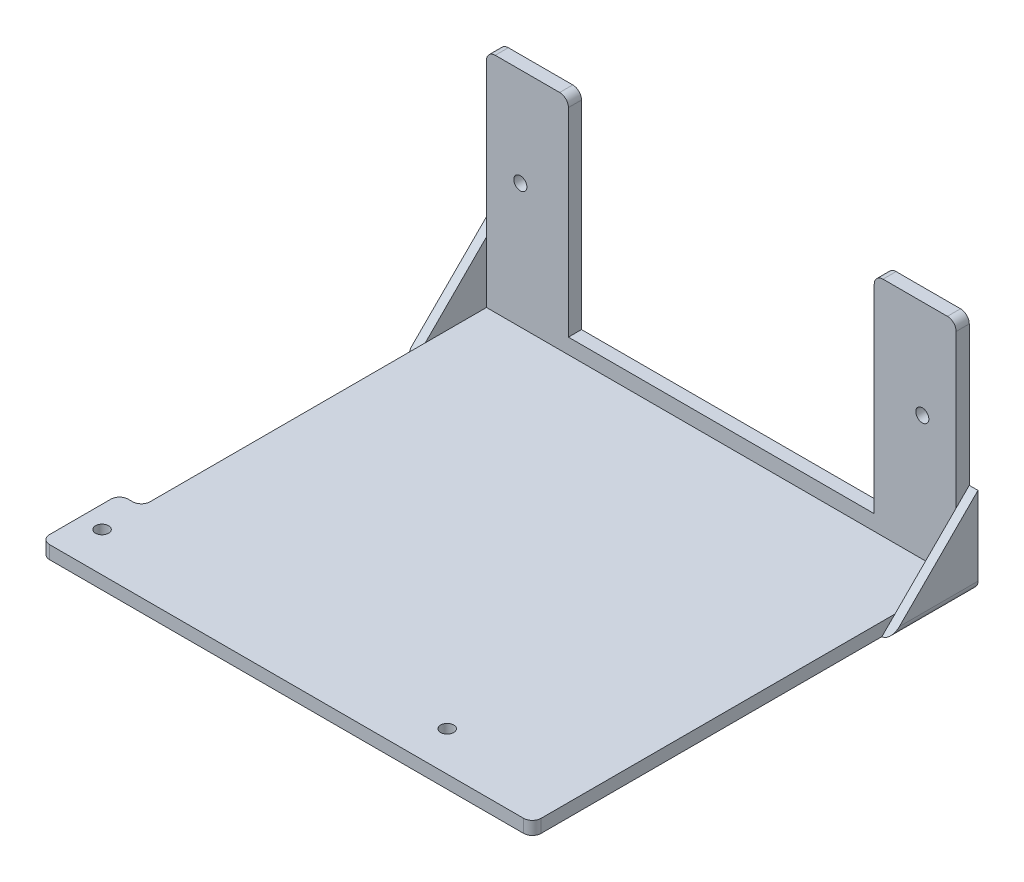
ISO-10303-21;
HEADER;
FILE_DESCRIPTION(('STEP AP214'),'2;1');
FILE_NAME('part.step','',(''),(''),'','','');
FILE_SCHEMA(('AUTOMOTIVE_DESIGN { 1 0 10303 214 1 1 1 1 }'));
ENDSEC;
DATA;
#1=APPLICATION_CONTEXT('core data for automotive mechanical design processes');
#2=APPLICATION_PROTOCOL_DEFINITION('international standard','automotive_design',2000,#1);
#3=PRODUCT_CONTEXT('',#1,'mechanical');
#4=PRODUCT('Part','Part','',(#3));
#5=PRODUCT_RELATED_PRODUCT_CATEGORY('part','',(#4));
#6=PRODUCT_DEFINITION_FORMATION('','',#4);
#7=PRODUCT_DEFINITION_CONTEXT('part definition',#1,'design');
#8=PRODUCT_DEFINITION('design','',#6,#7);
#9=PRODUCT_DEFINITION_SHAPE('','',#8);
#10=(LENGTH_UNIT() NAMED_UNIT(*) SI_UNIT(.MILLI.,.METRE.));
#11=(NAMED_UNIT(*) PLANE_ANGLE_UNIT() SI_UNIT($,.RADIAN.));
#12=(NAMED_UNIT(*) SI_UNIT($,.STERADIAN.) SOLID_ANGLE_UNIT());
#13=UNCERTAINTY_MEASURE_WITH_UNIT(LENGTH_MEASURE(1.E-05),#10,'distance_accuracy_value','');
#14=(GEOMETRIC_REPRESENTATION_CONTEXT(3) GLOBAL_UNCERTAINTY_ASSIGNED_CONTEXT((#13)) GLOBAL_UNIT_ASSIGNED_CONTEXT((#10,
#11,#12)) REPRESENTATION_CONTEXT('',''));
#15=CARTESIAN_POINT('',(0.,0.,0.));
#16=DIRECTION('',(0.,0.,1.));
#17=DIRECTION('',(1.,0.,0.));
#18=AXIS2_PLACEMENT_3D('',#15,#16,#17);
#19=CARTESIAN_POINT('',(53.75,54.,3.));
#20=DIRECTION('',(-1.,0.,0.));
#21=DIRECTION('',(0.,-1.,0.));
#22=AXIS2_PLACEMENT_3D('',#19,#20,#21);
#23=PLANE('',#22);
#24=DIRECTION('',(0.,1.,0.));
#25=VECTOR('',#24,1.);
#26=CARTESIAN_POINT('',(53.75,54.,0.));
#27=LINE('',#26,#25);
#28=CARTESIAN_POINT('',(53.75,20.,0.));
#29=VERTEX_POINT('',#28);
#30=CARTESIAN_POINT('',(53.75,52.,0.));
#31=VERTEX_POINT('',#30);
#32=EDGE_CURVE('E236',#29,#31,#27,.T.);
#33=ORIENTED_EDGE('',*,*,#32,.T.);
#34=DIRECTION('',(0.,0.,-1.));
#35=VECTOR('',#34,1.);
#36=CARTESIAN_POINT('',(53.75,52.,3.));
#37=LINE('',#36,#35);
#38=CARTESIAN_POINT('',(53.75,52.,3.));
#39=VERTEX_POINT('',#38);
#40=EDGE_CURVE('E390',#31,#39,#37,.F.);
#41=ORIENTED_EDGE('',*,*,#40,.T.);
#42=DIRECTION('',(0.,1.,0.));
#43=VECTOR('',#42,1.);
#44=CARTESIAN_POINT('',(53.75,54.,3.));
#45=LINE('',#44,#43);
#46=CARTESIAN_POINT('',(53.75,17.,3.));
#47=VERTEX_POINT('',#46);
#48=EDGE_CURVE('E338',#47,#39,#45,.T.);
#49=ORIENTED_EDGE('',*,*,#48,.F.);
#50=DIRECTION('',(0.,-0.707106781186551,0.707106781186544));
#51=VECTOR('',#50,1.);
#52=CARTESIAN_POINT('',(53.75,20.,0.));
#53=LINE('',#52,#51);
#54=EDGE_CURVE('E228',#29,#47,#53,.T.);
#55=ORIENTED_EDGE('',*,*,#54,.F.);
#56=EDGE_LOOP('',(#33,#41,#49,#55));
#57=FACE_BOUND('',#56,.T.);
#58=ADVANCED_FACE('F39',(#57),#23,.F.);
#59=DIRECTION('',(0.,0.,-1.));
#60=VECTOR('',#59,1.);
#61=CARTESIAN_POINT('',(53.75,3.,100.));
#62=LINE('',#61,#60);
#63=CARTESIAN_POINT('',(53.75,3.,98.));
#64=VERTEX_POINT('',#63);
#65=CARTESIAN_POINT('',(53.75,2.99999999999999,16.9999999999998));
#66=VERTEX_POINT('',#65);
#67=EDGE_CURVE('E333',#64,#66,#62,.T.);
#68=ORIENTED_EDGE('',*,*,#67,.F.);
#69=DIRECTION('',(0.,1.,0.));
#70=VECTOR('',#69,1.);
#71=CARTESIAN_POINT('',(53.75,0.,98.));
#72=LINE('',#71,#70);
#73=CARTESIAN_POINT('',(53.75,0.,98.));
#74=VERTEX_POINT('',#73);
#75=EDGE_CURVE('E423',#64,#74,#72,.F.);
#76=ORIENTED_EDGE('',*,*,#75,.T.);
#77=DIRECTION('',(0.,0.,-1.));
#78=VECTOR('',#77,1.);
#79=CARTESIAN_POINT('',(53.75,0.,3.));
#80=LINE('',#79,#78);
#81=CARTESIAN_POINT('',(53.75,0.,19.9999999999998));
#82=VERTEX_POINT('',#81);
#83=EDGE_CURVE('E355',#74,#82,#80,.T.);
#84=ORIENTED_EDGE('',*,*,#83,.T.);
#85=EDGE_CURVE('E248',#66,#82,#53,.T.);
#86=ORIENTED_EDGE('',*,*,#85,.F.);
#87=EDGE_LOOP('',(#68,#76,#84,#86));
#88=FACE_BOUND('',#87,.T.);
#89=ADVANCED_FACE('F475',(#88),#23,.F.);
#90=CARTESIAN_POINT('',(-53.75,54.,3.));
#91=DIRECTION('',(1.,0.,0.));
#92=DIRECTION('',(0.,1.,0.));
#93=AXIS2_PLACEMENT_3D('',#90,#91,#92);
#94=PLANE('',#93);
#95=DIRECTION('',(0.,0.,-1.));
#96=VECTOR('',#95,1.);
#97=CARTESIAN_POINT('',(-53.75,0.,3.));
#98=LINE('',#97,#96);
#99=CARTESIAN_POINT('',(-53.75,0.,80.));
#100=VERTEX_POINT('',#99);
#101=CARTESIAN_POINT('',(-53.75,0.,20.));
#102=VERTEX_POINT('',#101);
#103=EDGE_CURVE('E357',#100,#102,#98,.T.);
#104=ORIENTED_EDGE('',*,*,#103,.F.);
#105=DIRECTION('',(0.,1.,0.));
#106=VECTOR('',#105,1.);
#107=CARTESIAN_POINT('',(-53.75,54.,80.));
#108=LINE('',#107,#106);
#109=CARTESIAN_POINT('',(-53.75,2.99999999999999,80.));
#110=VERTEX_POINT('',#109);
#111=EDGE_CURVE('E439',#100,#110,#108,.T.);
#112=ORIENTED_EDGE('',*,*,#111,.T.);
#113=DIRECTION('',(0.,0.,-1.));
#114=VECTOR('',#113,1.);
#115=CARTESIAN_POINT('',(-53.75,2.99999999999999,100.));
#116=LINE('',#115,#114);
#117=CARTESIAN_POINT('',(-53.75,2.99999999999999,17.));
#118=VERTEX_POINT('',#117);
#119=EDGE_CURVE('E330',#110,#118,#116,.T.);
#120=ORIENTED_EDGE('',*,*,#119,.T.);
#121=DIRECTION('',(0.,0.707106781186548,-0.707106781186547));
#122=VECTOR('',#121,1.);
#123=CARTESIAN_POINT('',(-53.75,0.,20.));
#124=LINE('',#123,#122);
#125=EDGE_CURVE('E254',#102,#118,#124,.T.);
#126=ORIENTED_EDGE('',*,*,#125,.F.);
#127=EDGE_LOOP('',(#104,#112,#120,#126));
#128=FACE_BOUND('',#127,.T.);
#129=ADVANCED_FACE('F456',(#128),#94,.F.);
#130=DIRECTION('',(0.,-1.,0.));
#131=VECTOR('',#130,1.);
#132=CARTESIAN_POINT('',(-53.75,54.,3.));
#133=LINE('',#132,#131);
#134=CARTESIAN_POINT('',(-53.75,52.,3.));
#135=VERTEX_POINT('',#134);
#136=CARTESIAN_POINT('',(-53.75,17.,3.));
#137=VERTEX_POINT('',#136);
#138=EDGE_CURVE('E336',#135,#137,#133,.T.);
#139=ORIENTED_EDGE('',*,*,#138,.F.);
#140=DIRECTION('',(0.,0.,-1.));
#141=VECTOR('',#140,1.);
#142=CARTESIAN_POINT('',(-53.75,52.,3.));
#143=LINE('',#142,#141);
#144=CARTESIAN_POINT('',(-53.75,52.,0.));
#145=VERTEX_POINT('',#144);
#146=EDGE_CURVE('E409',#135,#145,#143,.T.);
#147=ORIENTED_EDGE('',*,*,#146,.T.);
#148=DIRECTION('',(0.,-1.,0.));
#149=VECTOR('',#148,1.);
#150=CARTESIAN_POINT('',(-53.75,54.,0.));
#151=LINE('',#150,#149);
#152=CARTESIAN_POINT('',(-53.75,20.,0.));
#153=VERTEX_POINT('',#152);
#154=EDGE_CURVE('E335',#145,#153,#151,.T.);
#155=ORIENTED_EDGE('',*,*,#154,.T.);
#156=EDGE_CURVE('E239',#137,#153,#124,.T.);
#157=ORIENTED_EDGE('',*,*,#156,.F.);
#158=EDGE_LOOP('',(#139,#147,#155,#157));
#159=FACE_BOUND('',#158,.T.);
#160=ADVANCED_FACE('F528',(#159),#94,.F.);
#161=CARTESIAN_POINT('',(-53.75,54.,3.));
#162=DIRECTION('',(0.,-1.,0.));
#163=DIRECTION('',(1.,0.,0.));
#164=AXIS2_PLACEMENT_3D('',#161,#162,#163);
#165=PLANE('',#164);
#166=DIRECTION('',(-1.,0.,0.));
#167=VECTOR('',#166,1.);
#168=CARTESIAN_POINT('',(-53.75,54.,3.));
#169=LINE('',#168,#167);
#170=CARTESIAN_POINT('',(-37.,54.,3.));
#171=VERTEX_POINT('',#170);
#172=CARTESIAN_POINT('',(-51.75,54.,3.));
#173=VERTEX_POINT('',#172);
#174=EDGE_CURVE('E343',#171,#173,#169,.T.);
#175=ORIENTED_EDGE('',*,*,#174,.F.);
#176=DIRECTION('',(0.,0.,1.));
#177=VECTOR('',#176,1.);
#178=CARTESIAN_POINT('',(-37.,54.,3.));
#179=LINE('',#178,#177);
#180=CARTESIAN_POINT('',(-37.,54.,0.));
#181=VERTEX_POINT('',#180);
#182=EDGE_CURVE('E407',#171,#181,#179,.F.);
#183=ORIENTED_EDGE('',*,*,#182,.T.);
#184=DIRECTION('',(-1.,0.,0.));
#185=VECTOR('',#184,1.);
#186=CARTESIAN_POINT('',(-53.75,54.,0.));
#187=LINE('',#186,#185);
#188=CARTESIAN_POINT('',(-51.75,54.,0.));
#189=VERTEX_POINT('',#188);
#190=EDGE_CURVE('E352',#181,#189,#187,.T.);
#191=ORIENTED_EDGE('',*,*,#190,.T.);
#192=DIRECTION('',(0.,0.,-1.));
#193=VECTOR('',#192,1.);
#194=CARTESIAN_POINT('',(-51.75,54.,3.));
#195=LINE('',#194,#193);
#196=EDGE_CURVE('E405',#189,#173,#195,.F.);
#197=ORIENTED_EDGE('',*,*,#196,.T.);
#198=EDGE_LOOP('',(#175,#183,#191,#197));
#199=FACE_BOUND('',#198,.T.);
#200=ADVANCED_FACE('F524',(#199),#165,.F.);
#201=CARTESIAN_POINT('',(-53.75,0.,3.));
#202=DIRECTION('',(0.,1.,0.));
#203=DIRECTION('',(0.,0.,1.));
#204=AXIS2_PLACEMENT_3D('',#201,#202,#203);
#205=PLANE('',#204);
#206=CARTESIAN_POINT('',(-53.75,0.,91.));
#207=DIRECTION('',(0.,1.,0.));
#208=DIRECTION('',(-1.,0.,0.));
#209=AXIS2_PLACEMENT_3D('',#206,#207,#208);
#210=CIRCLE('',#209,1.5);
#211=CARTESIAN_POINT('',(-55.25,0.,91.));
#212=VERTEX_POINT('',#211);
#213=EDGE_CURVE('E299',#212,#212,#210,.T.);
#214=ORIENTED_EDGE('',*,*,#213,.T.);
#215=EDGE_LOOP('',(#214));
#216=FACE_BOUND('',#215,.T.);
#217=CARTESIAN_POINT('',(25.25,0.,91.));
#218=DIRECTION('',(0.,1.,0.));
#219=DIRECTION('',(-1.,0.,0.));
#220=AXIS2_PLACEMENT_3D('',#217,#218,#219);
#221=CIRCLE('',#220,1.5);
#222=CARTESIAN_POINT('',(23.75,0.,91.));
#223=VERTEX_POINT('',#222);
#224=EDGE_CURVE('E306',#223,#223,#221,.T.);
#225=ORIENTED_EDGE('',*,*,#224,.T.);
#226=EDGE_LOOP('',(#225));
#227=FACE_BOUND('',#226,.T.);
#228=ORIENTED_EDGE('',*,*,#83,.F.);
#229=CARTESIAN_POINT('',(51.75,0.,98.));
#230=DIRECTION('',(0.,1.,0.));
#231=DIRECTION('',(0.,0.,1.));
#232=AXIS2_PLACEMENT_3D('',#229,#230,#231);
#233=CIRCLE('',#232,2.);
#234=CARTESIAN_POINT('',(51.75,0.,100.));
#235=VERTEX_POINT('',#234);
#236=EDGE_CURVE('E428',#74,#235,#233,.F.);
#237=ORIENTED_EDGE('',*,*,#236,.T.);
#238=DIRECTION('',(1.,0.,0.));
#239=VECTOR('',#238,1.);
#240=CARTESIAN_POINT('',(53.75,0.,100.));
#241=LINE('',#240,#239);
#242=CARTESIAN_POINT('',(-56.75,0.,100.));
#243=VERTEX_POINT('',#242);
#244=EDGE_CURVE('E325',#243,#235,#241,.T.);
#245=ORIENTED_EDGE('',*,*,#244,.F.);
#246=CARTESIAN_POINT('',(-56.75,0.,98.));
#247=DIRECTION('',(0.,1.,0.));
#248=DIRECTION('',(0.,0.,1.));
#249=AXIS2_PLACEMENT_3D('',#246,#247,#248);
#250=CIRCLE('',#249,2.);
#251=CARTESIAN_POINT('',(-58.75,0.,98.));
#252=VERTEX_POINT('',#251);
#253=EDGE_CURVE('E426',#243,#252,#250,.F.);
#254=ORIENTED_EDGE('',*,*,#253,.T.);
#255=DIRECTION('',(0.,0.,1.));
#256=VECTOR('',#255,1.);
#257=CARTESIAN_POINT('',(-58.75,0.,100.));
#258=LINE('',#257,#256);
#259=CARTESIAN_POINT('',(-58.75,0.,84.));
#260=VERTEX_POINT('',#259);
#261=EDGE_CURVE('E313',#260,#252,#258,.T.);
#262=ORIENTED_EDGE('',*,*,#261,.F.);
#263=CARTESIAN_POINT('',(-56.75,0.,84.));
#264=DIRECTION('',(0.,1.,0.));
#265=DIRECTION('',(0.,0.,1.));
#266=AXIS2_PLACEMENT_3D('',#263,#264,#265);
#267=CIRCLE('',#266,2.);
#268=CARTESIAN_POINT('',(-56.75,0.,82.));
#269=VERTEX_POINT('',#268);
#270=EDGE_CURVE('E54',#260,#269,#267,.F.);
#271=ORIENTED_EDGE('',*,*,#270,.T.);
#272=DIRECTION('',(-1.,0.,0.));
#273=VECTOR('',#272,1.);
#274=CARTESIAN_POINT('',(-53.75,0.,82.));
#275=LINE('',#274,#273);
#276=CARTESIAN_POINT('',(-55.75,0.,82.));
#277=VERTEX_POINT('',#276);
#278=EDGE_CURVE('E311',#277,#269,#275,.T.);
#279=ORIENTED_EDGE('',*,*,#278,.F.);
#280=CARTESIAN_POINT('',(-55.75,0.,80.));
#281=DIRECTION('',(0.,1.,0.));
#282=DIRECTION('',(0.,0.,1.));
#283=AXIS2_PLACEMENT_3D('',#280,#281,#282);
#284=CIRCLE('',#283,2.);
#285=EDGE_CURVE('E11',#277,#100,#284,.T.);
#286=ORIENTED_EDGE('',*,*,#285,.T.);
#287=ORIENTED_EDGE('',*,*,#103,.T.);
#288=DIRECTION('',(0.,0.,1.));
#289=VECTOR('',#288,1.);
#290=CARTESIAN_POINT('',(-53.75,0.,0.));
#291=LINE('',#290,#289);
#292=CARTESIAN_POINT('',(-53.75,0.,0.));
#293=VERTEX_POINT('',#292);
#294=EDGE_CURVE('E368',#102,#293,#291,.F.);
#295=ORIENTED_EDGE('',*,*,#294,.T.);
#296=DIRECTION('',(1.,0.,0.));
#297=VECTOR('',#296,1.);
#298=CARTESIAN_POINT('',(-53.75,0.,0.));
#299=LINE('',#298,#297);
#300=CARTESIAN_POINT('',(53.75,0.,0.));
#301=VERTEX_POINT('',#300);
#302=EDGE_CURVE('E348',#293,#301,#299,.T.);
#303=ORIENTED_EDGE('',*,*,#302,.T.);
#304=DIRECTION('',(0.,0.,-1.));
#305=VECTOR('',#304,1.);
#306=CARTESIAN_POINT('',(53.75,0.,19.9999999999998));
#307=LINE('',#306,#305);
#308=EDGE_CURVE('E365',#301,#82,#307,.F.);
#309=ORIENTED_EDGE('',*,*,#308,.T.);
#310=EDGE_LOOP('',(#228,#237,#245,#254,#262,#271,#279,#286,#287,#295,#303,#309));
#311=FACE_BOUND('',#310,.T.);
#312=ADVANCED_FACE('F453',(#216,#227,#311),#205,.F.);
#313=CARTESIAN_POINT('',(51.75,54.,3.));
#314=VERTEX_POINT('',#313);
#315=CARTESIAN_POINT('',(37.,54.,3.));
#316=VERTEX_POINT('',#315);
#317=EDGE_CURVE('E346',#314,#316,#169,.T.);
#318=ORIENTED_EDGE('',*,*,#317,.F.);
#319=DIRECTION('',(0.,0.,-1.));
#320=VECTOR('',#319,1.);
#321=CARTESIAN_POINT('',(51.75,54.,3.));
#322=LINE('',#321,#320);
#323=CARTESIAN_POINT('',(51.75,54.,0.));
#324=VERTEX_POINT('',#323);
#325=EDGE_CURVE('E387',#314,#324,#322,.T.);
#326=ORIENTED_EDGE('',*,*,#325,.T.);
#327=CARTESIAN_POINT('',(37.,54.,0.));
#328=VERTEX_POINT('',#327);
#329=EDGE_CURVE('E339',#324,#328,#187,.T.);
#330=ORIENTED_EDGE('',*,*,#329,.T.);
#331=DIRECTION('',(0.,0.,1.));
#332=VECTOR('',#331,1.);
#333=CARTESIAN_POINT('',(37.,54.,3.));
#334=LINE('',#333,#332);
#335=EDGE_CURVE('E384',#328,#316,#334,.T.);
#336=ORIENTED_EDGE('',*,*,#335,.T.);
#337=EDGE_LOOP('',(#318,#326,#330,#336));
#338=FACE_BOUND('',#337,.T.);
#339=ADVANCED_FACE('F520',(#338),#165,.F.);
#340=CARTESIAN_POINT('',(0.,0.,3.));
#341=DIRECTION('',(0.,0.,1.));
#342=DIRECTION('',(1.,0.,0.));
#343=AXIS2_PLACEMENT_3D('',#340,#341,#342);
#344=PLANE('',#343);
#345=CARTESIAN_POINT('',(46.,31.5,3.));
#346=DIRECTION('',(0.,0.,1.));
#347=DIRECTION('',(1.,0.,0.));
#348=AXIS2_PLACEMENT_3D('',#345,#346,#347);
#349=CIRCLE('',#348,1.5);
#350=CARTESIAN_POINT('',(47.5,31.5,3.));
#351=VERTEX_POINT('',#350);
#352=EDGE_CURVE('E270',#351,#351,#349,.T.);
#353=ORIENTED_EDGE('',*,*,#352,.F.);
#354=EDGE_LOOP('',(#353));
#355=FACE_BOUND('',#354,.T.);
#356=CARTESIAN_POINT('',(-46.,31.5,3.));
#357=DIRECTION('',(0.,0.,1.));
#358=DIRECTION('',(1.,0.,0.));
#359=AXIS2_PLACEMENT_3D('',#356,#357,#358);
#360=CIRCLE('',#359,1.5);
#361=CARTESIAN_POINT('',(-44.5,31.5,3.));
#362=VERTEX_POINT('',#361);
#363=EDGE_CURVE('E265',#362,#362,#360,.T.);
#364=ORIENTED_EDGE('',*,*,#363,.F.);
#365=EDGE_LOOP('',(#364));
#366=FACE_BOUND('',#365,.T.);
#367=ORIENTED_EDGE('',*,*,#48,.T.);
#368=CARTESIAN_POINT('',(51.75,52.,3.));
#369=DIRECTION('',(0.,0.,1.));
#370=DIRECTION('',(1.,0.,0.));
#371=AXIS2_PLACEMENT_3D('',#368,#369,#370);
#372=CIRCLE('',#371,2.);
#373=EDGE_CURVE('E398',#39,#314,#372,.T.);
#374=ORIENTED_EDGE('',*,*,#373,.T.);
#375=ORIENTED_EDGE('',*,*,#317,.T.);
#376=CARTESIAN_POINT('',(37.,52.,3.));
#377=DIRECTION('',(0.,0.,1.));
#378=DIRECTION('',(1.,0.,0.));
#379=AXIS2_PLACEMENT_3D('',#376,#377,#378);
#380=CIRCLE('',#379,2.);
#381=CARTESIAN_POINT('',(35.,52.,3.));
#382=VERTEX_POINT('',#381);
#383=EDGE_CURVE('E396',#316,#382,#380,.T.);
#384=ORIENTED_EDGE('',*,*,#383,.T.);
#385=DIRECTION('',(0.,1.,0.));
#386=VECTOR('',#385,1.);
#387=CARTESIAN_POINT('',(35.,54.,3.));
#388=LINE('',#387,#386);
#389=CARTESIAN_POINT('',(35.,6.5,3.));
#390=VERTEX_POINT('',#389);
#391=EDGE_CURVE('E281',#390,#382,#388,.T.);
#392=ORIENTED_EDGE('',*,*,#391,.F.);
#393=DIRECTION('',(1.,0.,0.));
#394=VECTOR('',#393,1.);
#395=CARTESIAN_POINT('',(-35.,6.5,3.));
#396=LINE('',#395,#394);
#397=CARTESIAN_POINT('',(-35.,6.5,3.));
#398=VERTEX_POINT('',#397);
#399=EDGE_CURVE('E289',#398,#390,#396,.T.);
#400=ORIENTED_EDGE('',*,*,#399,.F.);
#401=DIRECTION('',(0.,-1.,0.));
#402=VECTOR('',#401,1.);
#403=CARTESIAN_POINT('',(-35.,54.,3.));
#404=LINE('',#403,#402);
#405=CARTESIAN_POINT('',(-35.,52.,3.));
#406=VERTEX_POINT('',#405);
#407=EDGE_CURVE('E269',#406,#398,#404,.T.);
#408=ORIENTED_EDGE('',*,*,#407,.F.);
#409=CARTESIAN_POINT('',(-37.,52.,3.));
#410=DIRECTION('',(0.,0.,1.));
#411=DIRECTION('',(1.,0.,0.));
#412=AXIS2_PLACEMENT_3D('',#409,#410,#411);
#413=CIRCLE('',#412,2.);
#414=EDGE_CURVE('E394',#406,#171,#413,.T.);
#415=ORIENTED_EDGE('',*,*,#414,.T.);
#416=ORIENTED_EDGE('',*,*,#174,.T.);
#417=CARTESIAN_POINT('',(-51.75,52.,3.));
#418=DIRECTION('',(0.,0.,1.));
#419=DIRECTION('',(1.,0.,0.));
#420=AXIS2_PLACEMENT_3D('',#417,#418,#419);
#421=CIRCLE('',#420,2.);
#422=EDGE_CURVE('E392',#173,#135,#421,.T.);
#423=ORIENTED_EDGE('',*,*,#422,.T.);
#424=ORIENTED_EDGE('',*,*,#138,.T.);
#425=DIRECTION('',(0.,-1.,0.));
#426=VECTOR('',#425,1.);
#427=CARTESIAN_POINT('',(-53.75,0.,3.));
#428=LINE('',#427,#426);
#429=CARTESIAN_POINT('',(-53.75,2.99999999999999,3.));
#430=VERTEX_POINT('',#429);
#431=EDGE_CURVE('E262',#137,#430,#428,.T.);
#432=ORIENTED_EDGE('',*,*,#431,.T.);
#433=DIRECTION('',(-1.,0.,0.));
#434=VECTOR('',#433,1.);
#435=CARTESIAN_POINT('',(53.75,3.,3.));
#436=LINE('',#435,#434);
#437=CARTESIAN_POINT('',(53.75,3.,3.));
#438=VERTEX_POINT('',#437);
#439=EDGE_CURVE('E317',#438,#430,#436,.T.);
#440=ORIENTED_EDGE('',*,*,#439,.F.);
#441=EDGE_CURVE('E340',#438,#47,#45,.T.);
#442=ORIENTED_EDGE('',*,*,#441,.T.);
#443=EDGE_LOOP('',(#367,#374,#375,#384,#392,#400,#408,#415,#416,#423,#424,#432,#440,#442));
#444=FACE_BOUND('',#443,.T.);
#445=ADVANCED_FACE('F483',(#355,#366,#444),#344,.T.);
#446=CARTESIAN_POINT('',(0.,0.,0.));
#447=DIRECTION('',(0.,0.,1.));
#448=DIRECTION('',(1.,0.,0.));
#449=AXIS2_PLACEMENT_3D('',#446,#447,#448);
#450=PLANE('',#449);
#451=CARTESIAN_POINT('',(46.,31.5,0.));
#452=DIRECTION('',(0.,0.,1.));
#453=DIRECTION('',(1.,0.,0.));
#454=AXIS2_PLACEMENT_3D('',#451,#452,#453);
#455=CIRCLE('',#454,1.5);
#456=CARTESIAN_POINT('',(47.5,31.5,0.));
#457=VERTEX_POINT('',#456);
#458=EDGE_CURVE('E266',#457,#457,#455,.T.);
#459=ORIENTED_EDGE('',*,*,#458,.T.);
#460=EDGE_LOOP('',(#459));
#461=FACE_BOUND('',#460,.T.);
#462=CARTESIAN_POINT('',(-46.,31.5,0.));
#463=DIRECTION('',(0.,0.,1.));
#464=DIRECTION('',(1.,0.,0.));
#465=AXIS2_PLACEMENT_3D('',#462,#463,#464);
#466=CIRCLE('',#465,1.5);
#467=CARTESIAN_POINT('',(-44.5,31.5,0.));
#468=VERTEX_POINT('',#467);
#469=EDGE_CURVE('E273',#468,#468,#466,.T.);
#470=ORIENTED_EDGE('',*,*,#469,.T.);
#471=EDGE_LOOP('',(#470));
#472=FACE_BOUND('',#471,.T.);
#473=ORIENTED_EDGE('',*,*,#302,.F.);
#474=CARTESIAN_POINT('',(-53.75,2.,0.));
#475=DIRECTION('',(0.,0.,1.));
#476=DIRECTION('',(1.,0.,0.));
#477=AXIS2_PLACEMENT_3D('',#474,#475,#476);
#478=CIRCLE('',#477,2.);
#479=CARTESIAN_POINT('',(-55.75,2.,0.));
#480=VERTEX_POINT('',#479);
#481=EDGE_CURVE('E380',#293,#480,#478,.F.);
#482=ORIENTED_EDGE('',*,*,#481,.T.);
#483=DIRECTION('',(0.,-1.,0.));
#484=VECTOR('',#483,1.);
#485=CARTESIAN_POINT('',(-55.75,20.,0.));
#486=LINE('',#485,#484);
#487=CARTESIAN_POINT('',(-55.75,20.,0.));
#488=VERTEX_POINT('',#487);
#489=EDGE_CURVE('E250',#488,#480,#486,.T.);
#490=ORIENTED_EDGE('',*,*,#489,.F.);
#491=DIRECTION('',(1.,0.,0.));
#492=VECTOR('',#491,1.);
#493=CARTESIAN_POINT('',(-55.75,20.,0.));
#494=LINE('',#493,#492);
#495=EDGE_CURVE('E256',#488,#153,#494,.T.);
#496=ORIENTED_EDGE('',*,*,#495,.T.);
#497=ORIENTED_EDGE('',*,*,#154,.F.);
#498=CARTESIAN_POINT('',(-51.75,52.,0.));
#499=DIRECTION('',(0.,0.,1.));
#500=DIRECTION('',(1.,0.,0.));
#501=AXIS2_PLACEMENT_3D('',#498,#499,#500);
#502=CIRCLE('',#501,2.);
#503=EDGE_CURVE('E370',#145,#189,#502,.F.);
#504=ORIENTED_EDGE('',*,*,#503,.T.);
#505=ORIENTED_EDGE('',*,*,#190,.F.);
#506=CARTESIAN_POINT('',(-37.,52.,0.));
#507=DIRECTION('',(0.,0.,1.));
#508=DIRECTION('',(1.,0.,0.));
#509=AXIS2_PLACEMENT_3D('',#506,#507,#508);
#510=CIRCLE('',#509,2.);
#511=CARTESIAN_POINT('',(-35.,52.,0.));
#512=VERTEX_POINT('',#511);
#513=EDGE_CURVE('E372',#181,#512,#510,.F.);
#514=ORIENTED_EDGE('',*,*,#513,.T.);
#515=DIRECTION('',(0.,-1.,0.));
#516=VECTOR('',#515,1.);
#517=CARTESIAN_POINT('',(-35.,54.,0.));
#518=LINE('',#517,#516);
#519=CARTESIAN_POINT('',(-35.,6.5,0.));
#520=VERTEX_POINT('',#519);
#521=EDGE_CURVE('E278',#512,#520,#518,.T.);
#522=ORIENTED_EDGE('',*,*,#521,.T.);
#523=DIRECTION('',(1.,0.,0.));
#524=VECTOR('',#523,1.);
#525=CARTESIAN_POINT('',(-35.,6.5,0.));
#526=LINE('',#525,#524);
#527=CARTESIAN_POINT('',(35.,6.5,0.));
#528=VERTEX_POINT('',#527);
#529=EDGE_CURVE('E280',#520,#528,#526,.T.);
#530=ORIENTED_EDGE('',*,*,#529,.T.);
#531=DIRECTION('',(0.,1.,0.));
#532=VECTOR('',#531,1.);
#533=CARTESIAN_POINT('',(35.,54.,0.));
#534=LINE('',#533,#532);
#535=CARTESIAN_POINT('',(35.,52.,0.));
#536=VERTEX_POINT('',#535);
#537=EDGE_CURVE('E284',#528,#536,#534,.T.);
#538=ORIENTED_EDGE('',*,*,#537,.T.);
#539=CARTESIAN_POINT('',(37.,52.,0.));
#540=DIRECTION('',(0.,0.,1.));
#541=DIRECTION('',(1.,0.,0.));
#542=AXIS2_PLACEMENT_3D('',#539,#540,#541);
#543=CIRCLE('',#542,2.);
#544=EDGE_CURVE('E374',#536,#328,#543,.F.);
#545=ORIENTED_EDGE('',*,*,#544,.T.);
#546=ORIENTED_EDGE('',*,*,#329,.F.);
#547=CARTESIAN_POINT('',(51.75,52.,0.));
#548=DIRECTION('',(0.,0.,1.));
#549=DIRECTION('',(1.,0.,0.));
#550=AXIS2_PLACEMENT_3D('',#547,#548,#549);
#551=CIRCLE('',#550,2.);
#552=EDGE_CURVE('E376',#324,#31,#551,.F.);
#553=ORIENTED_EDGE('',*,*,#552,.T.);
#554=ORIENTED_EDGE('',*,*,#32,.F.);
#555=DIRECTION('',(-1.,0.,0.));
#556=VECTOR('',#555,1.);
#557=CARTESIAN_POINT('',(55.75,20.,0.));
#558=LINE('',#557,#556);
#559=CARTESIAN_POINT('',(55.75,20.,0.));
#560=VERTEX_POINT('',#559);
#561=EDGE_CURVE('E232',#560,#29,#558,.T.);
#562=ORIENTED_EDGE('',*,*,#561,.F.);
#563=DIRECTION('',(0.,1.,0.));
#564=VECTOR('',#563,1.);
#565=CARTESIAN_POINT('',(55.75,0.,0.));
#566=LINE('',#565,#564);
#567=CARTESIAN_POINT('',(55.75,2.,0.));
#568=VERTEX_POINT('',#567);
#569=EDGE_CURVE('E220',#568,#560,#566,.T.);
#570=ORIENTED_EDGE('',*,*,#569,.F.);
#571=CARTESIAN_POINT('',(53.75,2.,0.));
#572=DIRECTION('',(0.,0.,1.));
#573=DIRECTION('',(1.,0.,0.));
#574=AXIS2_PLACEMENT_3D('',#571,#572,#573);
#575=CIRCLE('',#574,2.);
#576=EDGE_CURVE('E378',#568,#301,#575,.F.);
#577=ORIENTED_EDGE('',*,*,#576,.T.);
#578=EDGE_LOOP('',(#473,#482,#490,#496,#497,#504,#505,#514,#522,#530,#538,#545,#546,#553,#554,
#562,#570,#577));
#579=FACE_BOUND('',#578,.T.);
#580=ADVANCED_FACE('F234',(#461,#472,#579),#450,.F.);
#581=CARTESIAN_POINT('',(53.75,3.,100.));
#582=DIRECTION('',(0.,-1.,0.));
#583=DIRECTION('',(1.,0.,0.));
#584=AXIS2_PLACEMENT_3D('',#581,#582,#583);
#585=PLANE('',#584);
#586=CARTESIAN_POINT('',(-53.75,2.99999999999999,91.));
#587=DIRECTION('',(0.,1.,0.));
#588=DIRECTION('',(-1.,0.,0.));
#589=AXIS2_PLACEMENT_3D('',#586,#587,#588);
#590=CIRCLE('',#589,1.5);
#591=CARTESIAN_POINT('',(-55.25,2.99999999999999,91.));
#592=VERTEX_POINT('',#591);
#593=EDGE_CURVE('E303',#592,#592,#590,.T.);
#594=ORIENTED_EDGE('',*,*,#593,.F.);
#595=EDGE_LOOP('',(#594));
#596=FACE_BOUND('',#595,.T.);
#597=CARTESIAN_POINT('',(25.25,3.,91.));
#598=DIRECTION('',(0.,1.,0.));
#599=DIRECTION('',(-1.,0.,0.));
#600=AXIS2_PLACEMENT_3D('',#597,#598,#599);
#601=CIRCLE('',#600,1.5);
#602=CARTESIAN_POINT('',(23.75,3.,91.));
#603=VERTEX_POINT('',#602);
#604=EDGE_CURVE('E296',#603,#603,#601,.T.);
#605=ORIENTED_EDGE('',*,*,#604,.F.);
#606=EDGE_LOOP('',(#605));
#607=FACE_BOUND('',#606,.T.);
#608=DIRECTION('',(-1.,0.,0.));
#609=VECTOR('',#608,1.);
#610=CARTESIAN_POINT('',(53.75,3.,100.));
#611=LINE('',#610,#609);
#612=CARTESIAN_POINT('',(51.75,3.,100.));
#613=VERTEX_POINT('',#612);
#614=CARTESIAN_POINT('',(-56.75,2.99999999999999,100.));
#615=VERTEX_POINT('',#614);
#616=EDGE_CURVE('E322',#613,#615,#611,.T.);
#617=ORIENTED_EDGE('',*,*,#616,.F.);
#618=CARTESIAN_POINT('',(51.75,3.,98.));
#619=DIRECTION('',(0.,-1.,0.));
#620=DIRECTION('',(1.,0.,0.));
#621=AXIS2_PLACEMENT_3D('',#618,#619,#620);
#622=CIRCLE('',#621,2.);
#623=EDGE_CURVE('E421',#613,#64,#622,.F.);
#624=ORIENTED_EDGE('',*,*,#623,.T.);
#625=ORIENTED_EDGE('',*,*,#67,.T.);
#626=EDGE_CURVE('E332',#66,#438,#62,.T.);
#627=ORIENTED_EDGE('',*,*,#626,.T.);
#628=ORIENTED_EDGE('',*,*,#439,.T.);
#629=EDGE_CURVE('E328',#118,#430,#116,.T.);
#630=ORIENTED_EDGE('',*,*,#629,.F.);
#631=ORIENTED_EDGE('',*,*,#119,.F.);
#632=CARTESIAN_POINT('',(-55.75,2.99999999999999,80.));
#633=DIRECTION('',(0.,-1.,0.));
#634=DIRECTION('',(1.,0.,0.));
#635=AXIS2_PLACEMENT_3D('',#632,#633,#634);
#636=CIRCLE('',#635,2.);
#637=CARTESIAN_POINT('',(-55.75,2.99999999999999,82.));
#638=VERTEX_POINT('',#637);
#639=EDGE_CURVE('E47',#110,#638,#636,.T.);
#640=ORIENTED_EDGE('',*,*,#639,.T.);
#641=DIRECTION('',(-1.,0.,0.));
#642=VECTOR('',#641,1.);
#643=CARTESIAN_POINT('',(-53.75,2.99999999999999,82.));
#644=LINE('',#643,#642);
#645=CARTESIAN_POINT('',(-56.75,2.99999999999999,82.));
#646=VERTEX_POINT('',#645);
#647=EDGE_CURVE('E302',#638,#646,#644,.T.);
#648=ORIENTED_EDGE('',*,*,#647,.T.);
#649=CARTESIAN_POINT('',(-56.75,2.99999999999999,84.));
#650=DIRECTION('',(0.,-1.,0.));
#651=DIRECTION('',(1.,0.,0.));
#652=AXIS2_PLACEMENT_3D('',#649,#650,#651);
#653=CIRCLE('',#652,2.);
#654=CARTESIAN_POINT('',(-58.75,2.99999999999999,84.));
#655=VERTEX_POINT('',#654);
#656=EDGE_CURVE('E417',#646,#655,#653,.F.);
#657=ORIENTED_EDGE('',*,*,#656,.T.);
#658=DIRECTION('',(0.,0.,1.));
#659=VECTOR('',#658,1.);
#660=CARTESIAN_POINT('',(-58.75,2.99999999999999,100.));
#661=LINE('',#660,#659);
#662=CARTESIAN_POINT('',(-58.75,2.99999999999999,98.));
#663=VERTEX_POINT('',#662);
#664=EDGE_CURVE('E314',#655,#663,#661,.T.);
#665=ORIENTED_EDGE('',*,*,#664,.T.);
#666=CARTESIAN_POINT('',(-56.75,2.99999999999999,98.));
#667=DIRECTION('',(0.,-1.,0.));
#668=DIRECTION('',(1.,0.,0.));
#669=AXIS2_PLACEMENT_3D('',#666,#667,#668);
#670=CIRCLE('',#669,2.);
#671=EDGE_CURVE('E419',#663,#615,#670,.F.);
#672=ORIENTED_EDGE('',*,*,#671,.T.);
#673=EDGE_LOOP('',(#617,#624,#625,#627,#628,#630,#631,#640,#648,#657,#665,#672));
#674=FACE_BOUND('',#673,.T.);
#675=ADVANCED_FACE('F444',(#596,#607,#674),#585,.F.);
#676=CARTESIAN_POINT('',(0.,0.,100.));
#677=DIRECTION('',(0.,0.,1.));
#678=DIRECTION('',(1.,0.,0.));
#679=AXIS2_PLACEMENT_3D('',#676,#677,#678);
#680=PLANE('',#679);
#681=ORIENTED_EDGE('',*,*,#244,.T.);
#682=DIRECTION('',(0.,1.,0.));
#683=VECTOR('',#682,1.);
#684=CARTESIAN_POINT('',(51.75,3.,100.));
#685=LINE('',#684,#683);
#686=EDGE_CURVE('E414',#235,#613,#685,.T.);
#687=ORIENTED_EDGE('',*,*,#686,.T.);
#688=ORIENTED_EDGE('',*,*,#616,.T.);
#689=DIRECTION('',(0.,1.,0.));
#690=VECTOR('',#689,1.);
#691=CARTESIAN_POINT('',(-56.75,0.,100.));
#692=LINE('',#691,#690);
#693=EDGE_CURVE('E412',#615,#243,#692,.F.);
#694=ORIENTED_EDGE('',*,*,#693,.T.);
#695=EDGE_LOOP('',(#681,#687,#688,#694));
#696=FACE_BOUND('',#695,.T.);
#697=ADVANCED_FACE('F570',(#696),#680,.T.);
#698=CARTESIAN_POINT('',(-58.75,0.,100.));
#699=DIRECTION('',(-1.,0.,0.));
#700=DIRECTION('',(0.,-1.,0.));
#701=AXIS2_PLACEMENT_3D('',#698,#699,#700);
#702=PLANE('',#701);
#703=ORIENTED_EDGE('',*,*,#261,.T.);
#704=DIRECTION('',(0.,1.,0.));
#705=VECTOR('',#704,1.);
#706=CARTESIAN_POINT('',(-58.75,0.,98.));
#707=LINE('',#706,#705);
#708=EDGE_CURVE('E432',#252,#663,#707,.T.);
#709=ORIENTED_EDGE('',*,*,#708,.T.);
#710=ORIENTED_EDGE('',*,*,#664,.F.);
#711=DIRECTION('',(0.,1.,0.));
#712=VECTOR('',#711,1.);
#713=CARTESIAN_POINT('',(-58.75,0.,84.));
#714=LINE('',#713,#712);
#715=EDGE_CURVE('E430',#655,#260,#714,.F.);
#716=ORIENTED_EDGE('',*,*,#715,.T.);
#717=EDGE_LOOP('',(#703,#709,#710,#716));
#718=FACE_BOUND('',#717,.T.);
#719=ADVANCED_FACE('F565',(#718),#702,.T.);
#720=CARTESIAN_POINT('',(-53.75,0.,82.));
#721=DIRECTION('',(0.,0.,-1.));
#722=DIRECTION('',(-1.,0.,0.));
#723=AXIS2_PLACEMENT_3D('',#720,#721,#722);
#724=PLANE('',#723);
#725=ORIENTED_EDGE('',*,*,#278,.T.);
#726=DIRECTION('',(0.,1.,0.));
#727=VECTOR('',#726,1.);
#728=CARTESIAN_POINT('',(-56.75,0.,82.));
#729=LINE('',#728,#727);
#730=EDGE_CURVE('E436',#269,#646,#729,.T.);
#731=ORIENTED_EDGE('',*,*,#730,.T.);
#732=ORIENTED_EDGE('',*,*,#647,.F.);
#733=DIRECTION('',(0.,1.,0.));
#734=VECTOR('',#733,1.);
#735=CARTESIAN_POINT('',(-55.75,0.,82.));
#736=LINE('',#735,#734);
#737=EDGE_CURVE('E61',#638,#277,#736,.F.);
#738=ORIENTED_EDGE('',*,*,#737,.T.);
#739=EDGE_LOOP('',(#725,#731,#732,#738));
#740=FACE_BOUND('',#739,.T.);
#741=ADVANCED_FACE('F448',(#740),#724,.T.);
#742=CARTESIAN_POINT('',(25.25,0.,91.));
#743=DIRECTION('',(0.,1.,0.));
#744=DIRECTION('',(-1.,0.,0.));
#745=AXIS2_PLACEMENT_3D('',#742,#743,#744);
#746=CYLINDRICAL_SURFACE('',#745,1.5);
#747=ORIENTED_EDGE('',*,*,#224,.F.);
#748=EDGE_LOOP('',(#747));
#749=FACE_BOUND('',#748,.T.);
#750=ORIENTED_EDGE('',*,*,#604,.T.);
#751=EDGE_LOOP('',(#750));
#752=FACE_BOUND('',#751,.T.);
#753=ADVANCED_FACE('F621',(#749,#752),#746,.F.);
#754=CARTESIAN_POINT('',(-53.75,0.,91.));
#755=DIRECTION('',(0.,1.,0.));
#756=DIRECTION('',(-1.,0.,0.));
#757=AXIS2_PLACEMENT_3D('',#754,#755,#756);
#758=CYLINDRICAL_SURFACE('',#757,1.5);
#759=ORIENTED_EDGE('',*,*,#213,.F.);
#760=EDGE_LOOP('',(#759));
#761=FACE_BOUND('',#760,.T.);
#762=ORIENTED_EDGE('',*,*,#593,.T.);
#763=EDGE_LOOP('',(#762));
#764=FACE_BOUND('',#763,.T.);
#765=ADVANCED_FACE('F617',(#761,#764),#758,.F.);
#766=CARTESIAN_POINT('',(-35.,54.,0.));
#767=DIRECTION('',(-1.,0.,0.));
#768=DIRECTION('',(0.,-1.,0.));
#769=AXIS2_PLACEMENT_3D('',#766,#767,#768);
#770=PLANE('',#769);
#771=ORIENTED_EDGE('',*,*,#521,.F.);
#772=DIRECTION('',(0.,0.,1.));
#773=VECTOR('',#772,1.);
#774=CARTESIAN_POINT('',(-35.,52.,0.));
#775=LINE('',#774,#773);
#776=EDGE_CURVE('E402',#512,#406,#775,.T.);
#777=ORIENTED_EDGE('',*,*,#776,.T.);
#778=ORIENTED_EDGE('',*,*,#407,.T.);
#779=DIRECTION('',(0.,0.,1.));
#780=VECTOR('',#779,1.);
#781=CARTESIAN_POINT('',(-35.,6.5,0.));
#782=LINE('',#781,#780);
#783=EDGE_CURVE('E287',#520,#398,#782,.T.);
#784=ORIENTED_EDGE('',*,*,#783,.F.);
#785=EDGE_LOOP('',(#771,#777,#778,#784));
#786=FACE_BOUND('',#785,.T.);
#787=ADVANCED_FACE('F613',(#786),#770,.F.);
#788=CARTESIAN_POINT('',(35.,54.,0.));
#789=DIRECTION('',(1.,0.,0.));
#790=DIRECTION('',(0.,1.,0.));
#791=AXIS2_PLACEMENT_3D('',#788,#789,#790);
#792=PLANE('',#791);
#793=ORIENTED_EDGE('',*,*,#391,.T.);
#794=DIRECTION('',(0.,0.,1.));
#795=VECTOR('',#794,1.);
#796=CARTESIAN_POINT('',(35.,52.,0.));
#797=LINE('',#796,#795);
#798=EDGE_CURVE('E400',#382,#536,#797,.F.);
#799=ORIENTED_EDGE('',*,*,#798,.T.);
#800=ORIENTED_EDGE('',*,*,#537,.F.);
#801=DIRECTION('',(0.,0.,1.));
#802=VECTOR('',#801,1.);
#803=CARTESIAN_POINT('',(35.,6.5,0.));
#804=LINE('',#803,#802);
#805=EDGE_CURVE('E294',#528,#390,#804,.T.);
#806=ORIENTED_EDGE('',*,*,#805,.T.);
#807=EDGE_LOOP('',(#793,#799,#800,#806));
#808=FACE_BOUND('',#807,.T.);
#809=ADVANCED_FACE('F608',(#808),#792,.F.);
#810=CARTESIAN_POINT('',(-35.,6.5,0.));
#811=DIRECTION('',(0.,-1.,0.));
#812=DIRECTION('',(0.,0.,-1.));
#813=AXIS2_PLACEMENT_3D('',#810,#811,#812);
#814=PLANE('',#813);
#815=ORIENTED_EDGE('',*,*,#399,.T.);
#816=ORIENTED_EDGE('',*,*,#805,.F.);
#817=ORIENTED_EDGE('',*,*,#529,.F.);
#818=ORIENTED_EDGE('',*,*,#783,.T.);
#819=EDGE_LOOP('',(#815,#816,#817,#818));
#820=FACE_BOUND('',#819,.T.);
#821=ADVANCED_FACE('F598',(#820),#814,.F.);
#822=CARTESIAN_POINT('',(-46.,31.5,0.));
#823=DIRECTION('',(0.,0.,1.));
#824=DIRECTION('',(1.,0.,0.));
#825=AXIS2_PLACEMENT_3D('',#822,#823,#824);
#826=CYLINDRICAL_SURFACE('',#825,1.5);
#827=ORIENTED_EDGE('',*,*,#469,.F.);
#828=EDGE_LOOP('',(#827));
#829=FACE_BOUND('',#828,.T.);
#830=ORIENTED_EDGE('',*,*,#363,.T.);
#831=EDGE_LOOP('',(#830));
#832=FACE_BOUND('',#831,.T.);
#833=ADVANCED_FACE('F595',(#829,#832),#826,.F.);
#834=CARTESIAN_POINT('',(46.,31.5,0.));
#835=DIRECTION('',(0.,0.,1.));
#836=DIRECTION('',(1.,0.,0.));
#837=AXIS2_PLACEMENT_3D('',#834,#835,#836);
#838=CYLINDRICAL_SURFACE('',#837,1.5);
#839=ORIENTED_EDGE('',*,*,#458,.F.);
#840=EDGE_LOOP('',(#839));
#841=FACE_BOUND('',#840,.T.);
#842=ORIENTED_EDGE('',*,*,#352,.T.);
#843=EDGE_LOOP('',(#842));
#844=FACE_BOUND('',#843,.T.);
#845=ADVANCED_FACE('F507',(#841,#844),#838,.F.);
#846=CARTESIAN_POINT('',(-55.75,0.,20.));
#847=DIRECTION('',(0.,-0.707106781186547,-0.707106781186548));
#848=DIRECTION('',(0.,0.707106781186548,-0.707106781186547));
#849=AXIS2_PLACEMENT_3D('',#846,#847,#848);
#850=PLANE('',#849);
#851=DIRECTION('',(0.,0.707106781186548,-0.707106781186547));
#852=VECTOR('',#851,1.);
#853=CARTESIAN_POINT('',(-55.75,0.,20.));
#854=LINE('',#853,#852);
#855=CARTESIAN_POINT('',(-55.75,2.,18.));
#856=VERTEX_POINT('',#855);
#857=EDGE_CURVE('E253',#856,#488,#854,.T.);
#858=ORIENTED_EDGE('',*,*,#857,.F.);
#859=CARTESIAN_POINT('',(-53.75,2.,18.));
#860=DIRECTION('',(0.,-0.707106781186547,-0.707106781186548));
#861=DIRECTION('',(0.,0.707106781186548,-0.707106781186547));
#862=AXIS2_PLACEMENT_3D('',#859,#860,#861);
#863=ELLIPSE('',#862,2.82842712474619,2.);
#864=EDGE_CURVE('E362',#856,#102,#863,.F.);
#865=ORIENTED_EDGE('',*,*,#864,.T.);
#866=ORIENTED_EDGE('',*,*,#125,.T.);
#867=EDGE_CURVE('E259',#118,#137,#124,.T.);
#868=ORIENTED_EDGE('',*,*,#867,.T.);
#869=ORIENTED_EDGE('',*,*,#156,.T.);
#870=ORIENTED_EDGE('',*,*,#495,.F.);
#871=EDGE_LOOP('',(#858,#865,#866,#868,#869,#870));
#872=FACE_BOUND('',#871,.T.);
#873=ADVANCED_FACE('F494',(#872),#850,.F.);
#874=CARTESIAN_POINT('',(-55.75,0.,0.));
#875=DIRECTION('',(-1.,0.,0.));
#876=DIRECTION('',(0.,0.,1.));
#877=AXIS2_PLACEMENT_3D('',#874,#875,#876);
#878=PLANE('',#877);
#879=ORIENTED_EDGE('',*,*,#489,.T.);
#880=DIRECTION('',(0.,0.,1.));
#881=VECTOR('',#880,1.);
#882=CARTESIAN_POINT('',(-55.75,2.,20.));
#883=LINE('',#882,#881);
#884=EDGE_CURVE('E359',#480,#856,#883,.T.);
#885=ORIENTED_EDGE('',*,*,#884,.T.);
#886=ORIENTED_EDGE('',*,*,#857,.T.);
#887=EDGE_LOOP('',(#879,#885,#886));
#888=FACE_BOUND('',#887,.T.);
#889=ADVANCED_FACE('F498',(#888),#878,.T.);
#890=CARTESIAN_POINT('',(-53.75,0.,0.));
#891=DIRECTION('',(-1.,0.,0.));
#892=DIRECTION('',(0.,0.,1.));
#893=AXIS2_PLACEMENT_3D('',#890,#891,#892);
#894=PLANE('',#893);
#895=ORIENTED_EDGE('',*,*,#431,.F.);
#896=ORIENTED_EDGE('',*,*,#867,.F.);
#897=ORIENTED_EDGE('',*,*,#629,.T.);
#898=EDGE_LOOP('',(#895,#896,#897));
#899=FACE_BOUND('',#898,.T.);
#900=ADVANCED_FACE('F490',(#899),#894,.F.);
#901=CARTESIAN_POINT('',(55.75,20.,0.));
#902=DIRECTION('',(0.,-0.707106781186544,-0.707106781186551));
#903=DIRECTION('',(0.,0.707106781186551,-0.707106781186544));
#904=AXIS2_PLACEMENT_3D('',#901,#902,#903);
#905=PLANE('',#904);
#906=ORIENTED_EDGE('',*,*,#85,.T.);
#907=CARTESIAN_POINT('',(53.75,2.,17.9999999999998));
#908=DIRECTION('',(0.,-0.707106781186544,-0.707106781186551));
#909=DIRECTION('',(0.,-0.707106781186551,0.707106781186544));
#910=AXIS2_PLACEMENT_3D('',#907,#908,#909);
#911=ELLIPSE('',#910,2.82842712474618,2.);
#912=CARTESIAN_POINT('',(55.75,2.,17.9999999999998));
#913=VERTEX_POINT('',#912);
#914=EDGE_CURVE('E244',#82,#913,#911,.F.);
#915=ORIENTED_EDGE('',*,*,#914,.T.);
#916=DIRECTION('',(0.,-0.707106781186551,0.707106781186544));
#917=VECTOR('',#916,1.);
#918=CARTESIAN_POINT('',(55.75,20.,0.));
#919=LINE('',#918,#917);
#920=EDGE_CURVE('E224',#560,#913,#919,.T.);
#921=ORIENTED_EDGE('',*,*,#920,.F.);
#922=ORIENTED_EDGE('',*,*,#561,.T.);
#923=ORIENTED_EDGE('',*,*,#54,.T.);
#924=EDGE_CURVE('E247',#47,#66,#53,.T.);
#925=ORIENTED_EDGE('',*,*,#924,.T.);
#926=EDGE_LOOP('',(#906,#915,#921,#922,#923,#925));
#927=FACE_BOUND('',#926,.T.);
#928=ADVANCED_FACE('F242',(#927),#905,.F.);
#929=CARTESIAN_POINT('',(55.75,0.,0.));
#930=DIRECTION('',(1.,0.,0.));
#931=DIRECTION('',(0.,0.,-1.));
#932=AXIS2_PLACEMENT_3D('',#929,#930,#931);
#933=PLANE('',#932);
#934=ORIENTED_EDGE('',*,*,#920,.T.);
#935=DIRECTION('',(0.,0.,-1.));
#936=VECTOR('',#935,1.);
#937=CARTESIAN_POINT('',(55.75,2.,0.));
#938=LINE('',#937,#936);
#939=EDGE_CURVE('E226',#913,#568,#938,.T.);
#940=ORIENTED_EDGE('',*,*,#939,.T.);
#941=ORIENTED_EDGE('',*,*,#569,.T.);
#942=EDGE_LOOP('',(#934,#940,#941));
#943=FACE_BOUND('',#942,.T.);
#944=ADVANCED_FACE('F222',(#943),#933,.T.);
#945=CARTESIAN_POINT('',(53.75,0.,0.));
#946=DIRECTION('',(1.,0.,0.));
#947=DIRECTION('',(0.,0.,-1.));
#948=AXIS2_PLACEMENT_3D('',#945,#946,#947);
#949=PLANE('',#948);
#950=ORIENTED_EDGE('',*,*,#441,.F.);
#951=ORIENTED_EDGE('',*,*,#626,.F.);
#952=ORIENTED_EDGE('',*,*,#924,.F.);
#953=EDGE_LOOP('',(#950,#951,#952));
#954=FACE_BOUND('',#953,.T.);
#955=ADVANCED_FACE('F479',(#954),#949,.F.);
#956=CARTESIAN_POINT('',(-53.75,2.,0.));
#957=DIRECTION('',(0.,0.,-1.));
#958=DIRECTION('',(-1.,0.,0.));
#959=AXIS2_PLACEMENT_3D('',#956,#957,#958);
#960=CYLINDRICAL_SURFACE('',#959,2.);
#961=ORIENTED_EDGE('',*,*,#481,.F.);
#962=ORIENTED_EDGE('',*,*,#294,.F.);
#963=ORIENTED_EDGE('',*,*,#864,.F.);
#964=ORIENTED_EDGE('',*,*,#884,.F.);
#965=EDGE_LOOP('',(#961,#962,#963,#964));
#966=FACE_BOUND('',#965,.T.);
#967=ADVANCED_FACE('F462',(#966),#960,.T.);
#968=CARTESIAN_POINT('',(53.75,2.,0.));
#969=DIRECTION('',(0.,0.,1.));
#970=DIRECTION('',(1.,0.,0.));
#971=AXIS2_PLACEMENT_3D('',#968,#969,#970);
#972=CYLINDRICAL_SURFACE('',#971,2.);
#973=ORIENTED_EDGE('',*,*,#914,.F.);
#974=ORIENTED_EDGE('',*,*,#308,.F.);
#975=ORIENTED_EDGE('',*,*,#576,.F.);
#976=ORIENTED_EDGE('',*,*,#939,.F.);
#977=EDGE_LOOP('',(#973,#974,#975,#976));
#978=FACE_BOUND('',#977,.T.);
#979=ADVANCED_FACE('F467',(#978),#972,.T.);
#980=CARTESIAN_POINT('',(51.75,52.,3.));
#981=DIRECTION('',(0.,0.,-1.));
#982=DIRECTION('',(-1.,0.,0.));
#983=AXIS2_PLACEMENT_3D('',#980,#981,#982);
#984=CYLINDRICAL_SURFACE('',#983,2.);
#985=ORIENTED_EDGE('',*,*,#373,.F.);
#986=ORIENTED_EDGE('',*,*,#40,.F.);
#987=ORIENTED_EDGE('',*,*,#552,.F.);
#988=ORIENTED_EDGE('',*,*,#325,.F.);
#989=EDGE_LOOP('',(#985,#986,#987,#988));
#990=FACE_BOUND('',#989,.T.);
#991=ADVANCED_FACE('F533',(#990),#984,.T.);
#992=CARTESIAN_POINT('',(37.,52.,3.));
#993=DIRECTION('',(0.,0.,1.));
#994=DIRECTION('',(1.,0.,0.));
#995=AXIS2_PLACEMENT_3D('',#992,#993,#994);
#996=CYLINDRICAL_SURFACE('',#995,2.);
#997=ORIENTED_EDGE('',*,*,#544,.F.);
#998=ORIENTED_EDGE('',*,*,#798,.F.);
#999=ORIENTED_EDGE('',*,*,#383,.F.);
#1000=ORIENTED_EDGE('',*,*,#335,.F.);
#1001=EDGE_LOOP('',(#997,#998,#999,#1000));
#1002=FACE_BOUND('',#1001,.T.);
#1003=ADVANCED_FACE('F536',(#1002),#996,.T.);
#1004=CARTESIAN_POINT('',(-37.,52.,0.));
#1005=DIRECTION('',(0.,0.,1.));
#1006=DIRECTION('',(1.,0.,0.));
#1007=AXIS2_PLACEMENT_3D('',#1004,#1005,#1006);
#1008=CYLINDRICAL_SURFACE('',#1007,2.);
#1009=ORIENTED_EDGE('',*,*,#513,.F.);
#1010=ORIENTED_EDGE('',*,*,#182,.F.);
#1011=ORIENTED_EDGE('',*,*,#414,.F.);
#1012=ORIENTED_EDGE('',*,*,#776,.F.);
#1013=EDGE_LOOP('',(#1009,#1010,#1011,#1012));
#1014=FACE_BOUND('',#1013,.T.);
#1015=ADVANCED_FACE('F540',(#1014),#1008,.T.);
#1016=CARTESIAN_POINT('',(-51.75,52.,3.));
#1017=DIRECTION('',(0.,0.,-1.));
#1018=DIRECTION('',(-1.,0.,0.));
#1019=AXIS2_PLACEMENT_3D('',#1016,#1017,#1018);
#1020=CYLINDRICAL_SURFACE('',#1019,2.);
#1021=ORIENTED_EDGE('',*,*,#422,.F.);
#1022=ORIENTED_EDGE('',*,*,#196,.F.);
#1023=ORIENTED_EDGE('',*,*,#503,.F.);
#1024=ORIENTED_EDGE('',*,*,#146,.F.);
#1025=EDGE_LOOP('',(#1021,#1022,#1023,#1024));
#1026=FACE_BOUND('',#1025,.T.);
#1027=ADVANCED_FACE('F544',(#1026),#1020,.T.);
#1028=CARTESIAN_POINT('',(51.75,0.,98.));
#1029=DIRECTION('',(0.,-1.,0.));
#1030=DIRECTION('',(1.,0.,0.));
#1031=AXIS2_PLACEMENT_3D('',#1028,#1029,#1030);
#1032=CYLINDRICAL_SURFACE('',#1031,2.);
#1033=ORIENTED_EDGE('',*,*,#236,.F.);
#1034=ORIENTED_EDGE('',*,*,#75,.F.);
#1035=ORIENTED_EDGE('',*,*,#623,.F.);
#1036=ORIENTED_EDGE('',*,*,#686,.F.);
#1037=EDGE_LOOP('',(#1033,#1034,#1035,#1036));
#1038=FACE_BOUND('',#1037,.T.);
#1039=ADVANCED_FACE('F548',(#1038),#1032,.T.);
#1040=CARTESIAN_POINT('',(-56.75,0.,98.));
#1041=DIRECTION('',(0.,1.,0.));
#1042=DIRECTION('',(-1.,0.,0.));
#1043=AXIS2_PLACEMENT_3D('',#1040,#1041,#1042);
#1044=CYLINDRICAL_SURFACE('',#1043,2.);
#1045=ORIENTED_EDGE('',*,*,#253,.F.);
#1046=ORIENTED_EDGE('',*,*,#693,.F.);
#1047=ORIENTED_EDGE('',*,*,#671,.F.);
#1048=ORIENTED_EDGE('',*,*,#708,.F.);
#1049=EDGE_LOOP('',(#1045,#1046,#1047,#1048));
#1050=FACE_BOUND('',#1049,.T.);
#1051=ADVANCED_FACE('F552',(#1050),#1044,.T.);
#1052=CARTESIAN_POINT('',(-56.75,0.,84.));
#1053=DIRECTION('',(0.,1.,0.));
#1054=DIRECTION('',(-1.,0.,0.));
#1055=AXIS2_PLACEMENT_3D('',#1052,#1053,#1054);
#1056=CYLINDRICAL_SURFACE('',#1055,2.);
#1057=ORIENTED_EDGE('',*,*,#270,.F.);
#1058=ORIENTED_EDGE('',*,*,#715,.F.);
#1059=ORIENTED_EDGE('',*,*,#656,.F.);
#1060=ORIENTED_EDGE('',*,*,#730,.F.);
#1061=EDGE_LOOP('',(#1057,#1058,#1059,#1060));
#1062=FACE_BOUND('',#1061,.T.);
#1063=ADVANCED_FACE('F555',(#1062),#1056,.T.);
#1064=CARTESIAN_POINT('',(-55.75,54.,80.));
#1065=DIRECTION('',(0.,1.,0.));
#1066=DIRECTION('',(-1.,0.,0.));
#1067=AXIS2_PLACEMENT_3D('',#1064,#1065,#1066);
#1068=CYLINDRICAL_SURFACE('',#1067,2.);
#1069=ORIENTED_EDGE('',*,*,#285,.F.);
#1070=ORIENTED_EDGE('',*,*,#737,.F.);
#1071=ORIENTED_EDGE('',*,*,#639,.F.);
#1072=ORIENTED_EDGE('',*,*,#111,.F.);
#1073=EDGE_LOOP('',(#1069,#1070,#1071,#1072));
#1074=FACE_BOUND('',#1073,.T.);
#1075=ADVANCED_FACE('F41',(#1074),#1068,.F.);
#1076=CLOSED_SHELL('',(#58,#89,#129,#160,#200,#312,#339,#445,#580,#675,#697,#719,#741,#753,#765,
#787,#809,#821,#833,#845,#873,#889,#900,#928,#944,#955,#967,#979,#991,#1003,#1015,#1027,#1039,
#1051,#1063,#1075));
#1077=MANIFOLD_SOLID_BREP('B2',#1076);
#1078=ADVANCED_BREP_SHAPE_REPRESENTATION('',(#18,#1077),#14);
#1079=SHAPE_DEFINITION_REPRESENTATION(#9,#1078);
ENDSEC;
END-ISO-10303-21;
